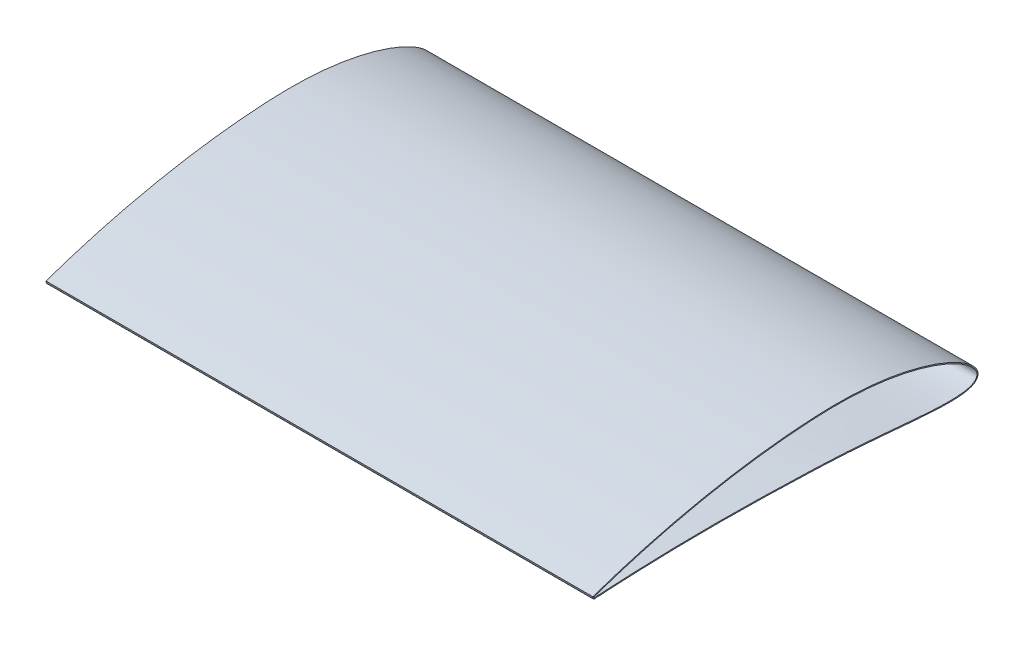
ISO-10303-21;
HEADER;
FILE_DESCRIPTION(('STEP AP214'),'2;1');
FILE_NAME('part.step','',(''),(''),'','','');
FILE_SCHEMA(('AUTOMOTIVE_DESIGN { 1 0 10303 214 1 1 1 1 }'));
ENDSEC;
DATA;
#1=APPLICATION_CONTEXT('core data for automotive mechanical design processes');
#2=APPLICATION_PROTOCOL_DEFINITION('international standard','automotive_design',2000,#1);
#3=PRODUCT_CONTEXT('',#1,'mechanical');
#4=PRODUCT('Part','Part','',(#3));
#5=PRODUCT_RELATED_PRODUCT_CATEGORY('part','',(#4));
#6=PRODUCT_DEFINITION_FORMATION('','',#4);
#7=PRODUCT_DEFINITION_CONTEXT('part definition',#1,'design');
#8=PRODUCT_DEFINITION('design','',#6,#7);
#9=PRODUCT_DEFINITION_SHAPE('','',#8);
#10=(LENGTH_UNIT() NAMED_UNIT(*) SI_UNIT(.MILLI.,.METRE.));
#11=(NAMED_UNIT(*) PLANE_ANGLE_UNIT() SI_UNIT($,.RADIAN.));
#12=(NAMED_UNIT(*) SI_UNIT($,.STERADIAN.) SOLID_ANGLE_UNIT());
#13=UNCERTAINTY_MEASURE_WITH_UNIT(LENGTH_MEASURE(1.E-05),#10,'distance_accuracy_value','');
#14=(GEOMETRIC_REPRESENTATION_CONTEXT(3) GLOBAL_UNCERTAINTY_ASSIGNED_CONTEXT((#13)) GLOBAL_UNIT_ASSIGNED_CONTEXT((#10,
#11,#12)) REPRESENTATION_CONTEXT('',''));
#15=CARTESIAN_POINT('',(0.,0.,0.));
#16=DIRECTION('',(0.,0.,1.));
#17=DIRECTION('',(1.,0.,0.));
#18=AXIS2_PLACEMENT_3D('',#15,#16,#17);
#19=CARTESIAN_POINT('',(-254.,-0.160012785393524,355.781288272021));
#20=CARTESIAN_POINT('',(-254.,-0.260724663014082,355.774783772929));
#21=CARTESIAN_POINT('',(-254.,-0.422606954620762,355.758637621734));
#22=CARTESIAN_POINT('',(-254.,-0.816807397927715,355.686815981531));
#23=CARTESIAN_POINT('',(-254.,-1.24668309021615,355.373142592051));
#24=CARTESIAN_POINT('',(-254.,-1.5235266277005,354.952837035878));
#25=CARTESIAN_POINT('',(-254.,-1.59412717480584,354.489636694886));
#26=CARTESIAN_POINT('',(-254.,-1.55511831483012,354.125296694906));
#27=CARTESIAN_POINT('',(-254.,-1.48926631006654,353.833974728871));
#28=CARTESIAN_POINT('',(-254.,-1.41795546513307,353.586061484338));
#29=CARTESIAN_POINT('',(-254.,-1.34320584663628,353.327273482467));
#30=CARTESIAN_POINT('',(-254.,-1.27751143428968,353.041582437258));
#31=CARTESIAN_POINT('',(-254.,-1.20688478411556,352.608380679005));
#32=CARTESIAN_POINT('',(-254.,-1.17596662973425,352.110927161072));
#33=CARTESIAN_POINT('',(-254.,-1.19263606913297,351.512724547263));
#34=CARTESIAN_POINT('',(-254.,-1.24772810685362,350.625622719737));
#35=CARTESIAN_POINT('',(-254.,-1.24043366886849,349.393297778936));
#36=CARTESIAN_POINT('',(-254.,-1.14106956808064,347.924581996849));
#37=CARTESIAN_POINT('',(-254.,-1.00501012741958,346.442969675704));
#38=CARTESIAN_POINT('',(-254.,-0.882175474662884,345.003214170463));
#39=CARTESIAN_POINT('',(-254.,-0.758153302013649,343.103292828497));
#40=CARTESIAN_POINT('',(-254.,-0.648856976782544,340.751794954618));
#41=CARTESIAN_POINT('',(-254.,-0.528754705676155,337.91042592086));
#42=CARTESIAN_POINT('',(-254.,-0.383405167440616,335.04987757254));
#43=CARTESIAN_POINT('',(-254.,-0.180109911055271,331.229276996453));
#44=CARTESIAN_POINT('',(-254.,0.0595542102886685,326.465376681876));
#45=CARTESIAN_POINT('',(-254.,0.311301964190964,320.757606453955));
#46=CARTESIAN_POINT('',(-254.,0.551818103414884,315.042784683889));
#47=CARTESIAN_POINT('',(-254.,0.776871866603853,309.325901329555));
#48=CARTESIAN_POINT('',(-254.,0.981309316548218,303.60966606416));
#49=CARTESIAN_POINT('',(-254.,1.22741464350278,295.987597162456));
#50=CARTESIAN_POINT('',(-254.,1.49505854858948,286.457612494315));
#51=CARTESIAN_POINT('',(-254.,1.74043742031699,275.021421222394));
#52=CARTESIAN_POINT('',(-254.,1.90420797940893,263.582914744213));
#53=CARTESIAN_POINT('',(-254.,1.99766923442384,252.143380177539));
#54=CARTESIAN_POINT('',(-254.,2.025028249374,236.89037417125));
#55=CARTESIAN_POINT('',(-254.,1.87690455809523,217.824281848333));
#56=CARTESIAN_POINT('',(-254.,1.44069626913339,194.945600608681));
#57=CARTESIAN_POINT('',(-254.,0.894354977689763,175.885320809337));
#58=CARTESIAN_POINT('',(-254.,0.366671857184103,160.635246225858));
#59=CARTESIAN_POINT('',(-254.,-0.151084525680473,145.383072414511));
#60=CARTESIAN_POINT('',(-254.,-0.963185187607268,126.343691669332));
#61=CARTESIAN_POINT('',(-254.,-2.29570442966772,107.332608050142));
#62=CARTESIAN_POINT('',(-254.,-3.55147070290262,92.131319946367));
#63=CARTESIAN_POINT('',(-254.,-4.55567876497996,80.7331703173261));
#64=CARTESIAN_POINT('',(-254.,-5.58263605824077,69.3332838340375));
#65=CARTESIAN_POINT('',(-254.,-6.58436139248711,57.9263635978013));
#66=CARTESIAN_POINT('',(-254.,-7.33868734097606,48.4067013657674));
#67=CARTESIAN_POINT('',(-254.,-7.83236475895651,40.7762422905909));
#68=CARTESIAN_POINT('',(-254.,-8.1273448501417,35.0454622837662));
#69=CARTESIAN_POINT('',(-254.,-8.31775249266283,29.3027203134908));
#70=CARTESIAN_POINT('',(-254.,-8.36146508783106,23.5483061910895));
#71=CARTESIAN_POINT('',(-254.,-8.18752966483548,17.7821248111899));
#72=CARTESIAN_POINT('',(-254.,-7.7690139933705,12.9595856167686));
#73=CARTESIAN_POINT('',(-254.,-7.14072544798187,9.11634215741616));
#74=CARTESIAN_POINT('',(-254.,-6.44631169359271,6.24127532632541));
#75=CARTESIAN_POINT('',(-254.,-5.45435028454066,3.40921725590063));
#76=CARTESIAN_POINT('',(-254.,-4.13367895958201,1.11523400102716));
#77=CARTESIAN_POINT('',(-254.,-2.54458809044118,-0.433867293340652));
#78=CARTESIAN_POINT('',(-254.,-1.10871967999657,-1.34390445793132));
#79=CARTESIAN_POINT('',(-254.,0.580355827871294,-1.82867386978638));
#80=CARTESIAN_POINT('',(-254.,2.85052153367501,-1.82668349147424));
#81=CARTESIAN_POINT('',(-254.,5.47061883086868,-0.953615267918231));
#82=CARTESIAN_POINT('',(-254.,7.99927871719681,0.809730437342807));
#83=CARTESIAN_POINT('',(-254.,10.2108294108204,2.80412445437323));
#84=CARTESIAN_POINT('',(-254.,12.8485000864783,5.72010294360929));
#85=CARTESIAN_POINT('',(-254.,15.7331042080959,9.63650689316799));
#86=CARTESIAN_POINT('',(-254.,18.7673719769425,14.5783925119411));
#87=CARTESIAN_POINT('',(-254.,21.4885809947311,19.6779964584068));
#88=CARTESIAN_POINT('',(-254.,23.9576606831746,24.8923985102312));
#89=CARTESIAN_POINT('',(-254.,26.9597143691512,31.9663037533705));
#90=CARTESIAN_POINT('',(-254.,30.2423904570102,40.9837374655094));
#91=CARTESIAN_POINT('',(-254.,33.5569382347417,52.0006694104999));
#92=CARTESIAN_POINT('',(-254.,36.3175708694355,63.1626167527749));
#93=CARTESIAN_POINT('',(-254.,38.5688563856449,74.4340414939907));
#94=CARTESIAN_POINT('',(-254.,40.936854636466,89.5703758686101));
#95=CARTESIAN_POINT('',(-254.,42.7966392687554,108.633179861665));
#96=CARTESIAN_POINT('',(-254.,43.3755286897958,131.607338659795));
#97=CARTESIAN_POINT('',(-254.,42.4483987385977,154.543117894496));
#98=CARTESIAN_POINT('',(-254.,40.6676492849251,177.399289958146));
#99=CARTESIAN_POINT('',(-254.,38.1139239789693,200.187559856485));
#100=CARTESIAN_POINT('',(-254.,33.7216535797013,230.439677725932));
#101=CARTESIAN_POINT('',(-254.,26.5041921859137,267.97219865512));
#102=CARTESIAN_POINT('',(-254.,17.1397742671702,305.022743766761));
#103=CARTESIAN_POINT('',(-254.,8.39870049896719,334.313734934284));
#104=CARTESIAN_POINT('',(-254.,3.55911324246915,348.806819492272));
#105=CARTESIAN_POINT('',(-254.,1.07078060987209,356.02943210171));
#106=B_SPLINE_CURVE_WITH_KNOTS('',3,(#19,#20,#21,#22,#23,#24,#25,#26,#27,#28,#29,#30,#31,#32,
#33,#34,#35,#36,#37,#38,#39,#40,#41,#42,#43,#44,#45,#46,#47,#48,#49,#50,#51,#52,#53,#54,#55,#56,
#57,#58,#59,#60,#61,#62,#63,#64,#65,#66,#67,#68,#69,#70,#71,#72,#73,#74,#75,#76,#77,#78,#79,#80,
#81,#82,#83,#84,#85,#86,#87,#88,#89,#90,#91,#92,#93,#94,#95,#96,#97,#98,#99,#100,#101,#102,#103,
#104,#105),.UNSPECIFIED.,.F.,.F.,(4,1,1,1,1,1,1,1,1,1,1,1,1,1,1,1,1,1,1,1,1,1,1,1,1,1,1,1,1,1,1,
1,1,1,1,1,1,1,1,1,1,1,1,1,1,1,1,1,1,1,1,1,1,1,1,1,1,1,1,1,1,1,1,1,1,1,1,1,1,1,1,1,1,1,1,1,1,1,1,
1,1,1,1,1,4),(-0.00119615790120819,-0.000951744244878199,-0.000707330588548209,
-0.000585123760383215,-0.00046291693221822,-0.000218503275888342,2.59103804415362E-05,
0.000270324036771525,0.000514737693101515,0.000759151349431504,0.00124797866209148,
0.00173680597475135,0.0027144606000712,0.00369211522539104,0.00466976985071089,
0.00662507910135047,0.00858038835199005,0.0105356976026297,0.0124910068532694,
0.0144463161039091,0.0183569346051885,0.0222675531064679,0.0261781716077473,0.0300887901090265,
0.0379100271115852,0.045731264114144,0.0535525011167026,0.0613737381192613,0.0691949751218199,
0.0770162121243786,0.092658686129496,0.108301160134613,0.123943634139731,0.139586108144848,
0.155228582149965,0.1865135301602,0.217798478170435,0.24908342618067,0.264725900185787,
0.280368374190904,0.311653322201139,0.342938270211374,0.358580744216491,0.374223218221608,
0.389865692226726,0.405508166231843,0.421150640236961,0.428971877239519,0.436793114242078,
0.444614351244637,0.452435588247195,0.460256825249754,0.468078062252313,0.471988680753592,
0.475899299254871,0.479809917756151,0.48372053625743,0.48567584550807,0.487631154758709,
0.489586464009349,0.491541773259989,0.495452391761268,0.499363010262547,0.503273628763827,
0.507184247265106,0.515005484267665,0.522826721270223,0.530647958272782,0.538469195275341,
0.546290432277899,0.561932906283017,0.577575380288134,0.593217854293251,0.608860328298369,
0.624502802303486,0.655787750313721,0.687072698323956,0.71835764633419,0.749642594344425,
0.78092754235466,0.812212490364895,0.874782386385364,0.937352282405833,0.968637230416068,
0.999922178426303),.UNSPECIFIED.);
#107=DIRECTION('',(1.,0.,0.));
#108=VECTOR('',#107,1.);
#109=SURFACE_OF_LINEAR_EXTRUSION('',#106,#108);
#110=DIRECTION('',(1.,0.,0.));
#111=VECTOR('',#110,1.);
#112=CARTESIAN_POINT('',(-254.,1.07078060987209,356.02943210171));
#113=LINE('',#112,#111);
#114=CARTESIAN_POINT('',(-254.,1.07078060987209,356.02943210171));
#115=VERTEX_POINT('',#114);
#116=CARTESIAN_POINT('',(254.,1.07078060987209,356.02943210171));
#117=VERTEX_POINT('',#116);
#118=EDGE_CURVE('E45',#115,#117,#113,.T.);
#119=ORIENTED_EDGE('',*,*,#118,.T.);
#120=CARTESIAN_POINT('',(254.,-0.160012785393524,355.781288272021));
#121=CARTESIAN_POINT('',(254.,-0.260724663014082,355.774783772929));
#122=CARTESIAN_POINT('',(254.,-0.422606954620762,355.758637621734));
#123=CARTESIAN_POINT('',(254.,-0.816807397927715,355.686815981531));
#124=CARTESIAN_POINT('',(254.,-1.24668309021615,355.373142592051));
#125=CARTESIAN_POINT('',(254.,-1.5235266277005,354.952837035878));
#126=CARTESIAN_POINT('',(254.,-1.59412717480584,354.489636694886));
#127=CARTESIAN_POINT('',(254.,-1.55511831483012,354.125296694906));
#128=CARTESIAN_POINT('',(254.,-1.48926631006654,353.833974728871));
#129=CARTESIAN_POINT('',(254.,-1.41795546513307,353.586061484338));
#130=CARTESIAN_POINT('',(254.,-1.34320584663628,353.327273482467));
#131=CARTESIAN_POINT('',(254.,-1.27751143428968,353.041582437258));
#132=CARTESIAN_POINT('',(254.,-1.20688478411556,352.608380679005));
#133=CARTESIAN_POINT('',(254.,-1.17596662973425,352.110927161072));
#134=CARTESIAN_POINT('',(254.,-1.19263606913297,351.512724547263));
#135=CARTESIAN_POINT('',(254.,-1.24772810685362,350.625622719737));
#136=CARTESIAN_POINT('',(254.,-1.24043366886849,349.393297778936));
#137=CARTESIAN_POINT('',(254.,-1.14106956808064,347.924581996849));
#138=CARTESIAN_POINT('',(254.,-1.00501012741958,346.442969675704));
#139=CARTESIAN_POINT('',(254.,-0.882175474662884,345.003214170463));
#140=CARTESIAN_POINT('',(254.,-0.758153302013649,343.103292828497));
#141=CARTESIAN_POINT('',(254.,-0.648856976782544,340.751794954618));
#142=CARTESIAN_POINT('',(254.,-0.528754705676155,337.91042592086));
#143=CARTESIAN_POINT('',(254.,-0.383405167440616,335.04987757254));
#144=CARTESIAN_POINT('',(254.,-0.180109911055271,331.229276996453));
#145=CARTESIAN_POINT('',(254.,0.0595542102886685,326.465376681876));
#146=CARTESIAN_POINT('',(254.,0.311301964190964,320.757606453955));
#147=CARTESIAN_POINT('',(254.,0.551818103414884,315.042784683889));
#148=CARTESIAN_POINT('',(254.,0.776871866603853,309.325901329555));
#149=CARTESIAN_POINT('',(254.,0.981309316548218,303.60966606416));
#150=CARTESIAN_POINT('',(254.,1.22741464350278,295.987597162456));
#151=CARTESIAN_POINT('',(254.,1.49505854858948,286.457612494315));
#152=CARTESIAN_POINT('',(254.,1.74043742031699,275.021421222394));
#153=CARTESIAN_POINT('',(254.,1.90420797940893,263.582914744213));
#154=CARTESIAN_POINT('',(254.,1.99766923442384,252.143380177539));
#155=CARTESIAN_POINT('',(254.,2.025028249374,236.89037417125));
#156=CARTESIAN_POINT('',(254.,1.87690455809523,217.824281848333));
#157=CARTESIAN_POINT('',(254.,1.44069626913339,194.945600608681));
#158=CARTESIAN_POINT('',(254.,0.894354977689763,175.885320809337));
#159=CARTESIAN_POINT('',(254.,0.366671857184103,160.635246225858));
#160=CARTESIAN_POINT('',(254.,-0.151084525680473,145.383072414511));
#161=CARTESIAN_POINT('',(254.,-0.963185187607268,126.343691669332));
#162=CARTESIAN_POINT('',(254.,-2.29570442966772,107.332608050142));
#163=CARTESIAN_POINT('',(254.,-3.55147070290262,92.131319946367));
#164=CARTESIAN_POINT('',(254.,-4.55567876497996,80.7331703173261));
#165=CARTESIAN_POINT('',(254.,-5.58263605824077,69.3332838340375));
#166=CARTESIAN_POINT('',(254.,-6.58436139248711,57.9263635978013));
#167=CARTESIAN_POINT('',(254.,-7.33868734097606,48.4067013657674));
#168=CARTESIAN_POINT('',(254.,-7.83236475895651,40.7762422905909));
#169=CARTESIAN_POINT('',(254.,-8.1273448501417,35.0454622837662));
#170=CARTESIAN_POINT('',(254.,-8.31775249266283,29.3027203134908));
#171=CARTESIAN_POINT('',(254.,-8.36146508783106,23.5483061910895));
#172=CARTESIAN_POINT('',(254.,-8.18752966483548,17.7821248111899));
#173=CARTESIAN_POINT('',(254.,-7.7690139933705,12.9595856167686));
#174=CARTESIAN_POINT('',(254.,-7.14072544798187,9.11634215741616));
#175=CARTESIAN_POINT('',(254.,-6.44631169359271,6.24127532632541));
#176=CARTESIAN_POINT('',(254.,-5.45435028454066,3.40921725590063));
#177=CARTESIAN_POINT('',(254.,-4.13367895958201,1.11523400102716));
#178=CARTESIAN_POINT('',(254.,-2.54458809044118,-0.433867293340652));
#179=CARTESIAN_POINT('',(254.,-1.10871967999657,-1.34390445793132));
#180=CARTESIAN_POINT('',(254.,0.580355827871294,-1.82867386978638));
#181=CARTESIAN_POINT('',(254.,2.85052153367501,-1.82668349147424));
#182=CARTESIAN_POINT('',(254.,5.47061883086868,-0.953615267918231));
#183=CARTESIAN_POINT('',(254.,7.99927871719681,0.809730437342807));
#184=CARTESIAN_POINT('',(254.,10.2108294108204,2.80412445437323));
#185=CARTESIAN_POINT('',(254.,12.8485000864783,5.72010294360929));
#186=CARTESIAN_POINT('',(254.,15.7331042080959,9.63650689316799));
#187=CARTESIAN_POINT('',(254.,18.7673719769425,14.5783925119411));
#188=CARTESIAN_POINT('',(254.,21.4885809947311,19.6779964584068));
#189=CARTESIAN_POINT('',(254.,23.9576606831746,24.8923985102312));
#190=CARTESIAN_POINT('',(254.,26.9597143691512,31.9663037533705));
#191=CARTESIAN_POINT('',(254.,30.2423904570102,40.9837374655094));
#192=CARTESIAN_POINT('',(254.,33.5569382347417,52.0006694104999));
#193=CARTESIAN_POINT('',(254.,36.3175708694355,63.1626167527749));
#194=CARTESIAN_POINT('',(254.,38.5688563856449,74.4340414939907));
#195=CARTESIAN_POINT('',(254.,40.936854636466,89.5703758686101));
#196=CARTESIAN_POINT('',(254.,42.7966392687554,108.633179861665));
#197=CARTESIAN_POINT('',(254.,43.3755286897958,131.607338659795));
#198=CARTESIAN_POINT('',(254.,42.4483987385977,154.543117894496));
#199=CARTESIAN_POINT('',(254.,40.6676492849251,177.399289958146));
#200=CARTESIAN_POINT('',(254.,38.1139239789693,200.187559856485));
#201=CARTESIAN_POINT('',(254.,33.7216535797013,230.439677725932));
#202=CARTESIAN_POINT('',(254.,26.5041921859137,267.97219865512));
#203=CARTESIAN_POINT('',(254.,17.1397742671702,305.022743766761));
#204=CARTESIAN_POINT('',(254.,8.39870049896719,334.313734934284));
#205=CARTESIAN_POINT('',(254.,3.55911324246915,348.806819492272));
#206=CARTESIAN_POINT('',(254.,1.07078060987209,356.02943210171));
#207=B_SPLINE_CURVE_WITH_KNOTS('',3,(#120,#121,#122,#123,#124,#125,#126,#127,#128,#129,#130,
#131,#132,#133,#134,#135,#136,#137,#138,#139,#140,#141,#142,#143,#144,#145,#146,#147,#148,#149,
#150,#151,#152,#153,#154,#155,#156,#157,#158,#159,#160,#161,#162,#163,#164,#165,#166,#167,#168,
#169,#170,#171,#172,#173,#174,#175,#176,#177,#178,#179,#180,#181,#182,#183,#184,#185,#186,#187,
#188,#189,#190,#191,#192,#193,#194,#195,#196,#197,#198,#199,#200,#201,#202,#203,#204,#205,#206),
.UNSPECIFIED.,.F.,.F.,(4,1,1,1,1,1,1,1,1,1,1,1,1,1,1,1,1,1,1,1,1,1,1,1,1,1,1,1,1,1,1,1,1,1,1,1,
1,1,1,1,1,1,1,1,1,1,1,1,1,1,1,1,1,1,1,1,1,1,1,1,1,1,1,1,1,1,1,1,1,1,1,1,1,1,1,1,1,1,1,1,1,1,1,1,
4),(-0.00119615790120819,-0.000951744244878199,-0.000707330588548209,-0.000585123760383215,
-0.00046291693221822,-0.000218503275888342,2.59103804415362E-05,0.000270324036771525,
0.000514737693101515,0.000759151349431504,0.00124797866209148,0.00173680597475135,
0.0027144606000712,0.00369211522539104,0.00466976985071089,0.00662507910135047,
0.00858038835199005,0.0105356976026297,0.0124910068532694,0.0144463161039091,0.0183569346051885,
0.0222675531064679,0.0261781716077473,0.0300887901090265,0.0379100271115852,0.045731264114144,
0.0535525011167026,0.0613737381192613,0.0691949751218199,0.0770162121243786,0.092658686129496,
0.108301160134613,0.123943634139731,0.139586108144848,0.155228582149965,0.1865135301602,
0.217798478170435,0.24908342618067,0.264725900185787,0.280368374190904,0.311653322201139,
0.342938270211374,0.358580744216491,0.374223218221608,0.389865692226726,0.405508166231843,
0.421150640236961,0.428971877239519,0.436793114242078,0.444614351244637,0.452435588247195,
0.460256825249754,0.468078062252313,0.471988680753592,0.475899299254871,0.479809917756151,
0.48372053625743,0.48567584550807,0.487631154758709,0.489586464009349,0.491541773259989,
0.495452391761268,0.499363010262547,0.503273628763827,0.507184247265106,0.515005484267665,
0.522826721270223,0.530647958272782,0.538469195275341,0.546290432277899,0.561932906283017,
0.577575380288134,0.593217854293251,0.608860328298369,0.624502802303486,0.655787750313721,
0.687072698323956,0.71835764633419,0.749642594344425,0.78092754235466,0.812212490364895,
0.874782386385364,0.937352282405833,0.968637230416068,0.999922178426303),.UNSPECIFIED.);
#208=CARTESIAN_POINT('',(254.,-0.160012785393524,355.781288272021));
#209=VERTEX_POINT('',#208);
#210=EDGE_CURVE('E97',#209,#117,#207,.T.);
#211=ORIENTED_EDGE('',*,*,#210,.F.);
#212=DIRECTION('',(1.,0.,0.));
#213=VECTOR('',#212,1.);
#214=CARTESIAN_POINT('',(-254.,-0.160012785393524,355.781288272021));
#215=LINE('',#214,#213);
#216=CARTESIAN_POINT('',(-254.,-0.160012785393524,355.781288272021));
#217=VERTEX_POINT('',#216);
#218=EDGE_CURVE('E11',#217,#209,#215,.T.);
#219=ORIENTED_EDGE('',*,*,#218,.F.);
#220=EDGE_CURVE('E90',#217,#115,#106,.T.);
#221=ORIENTED_EDGE('',*,*,#220,.T.);
#222=EDGE_LOOP('',(#119,#211,#219,#221));
#223=FACE_BOUND('',#222,.T.);
#224=ADVANCED_FACE('F41',(#223),#109,.T.);
#225=CARTESIAN_POINT('',(-254.,-0.160012785393524,355.781288272021));
#226=DIRECTION('',(0.,-0.197636177725009,0.98027544152358));
#227=DIRECTION('',(0.,-0.98027544152358,-0.197636177725009));
#228=AXIS2_PLACEMENT_3D('',#225,#226,#227);
#229=PLANE('',#228);
#230=ORIENTED_EDGE('',*,*,#218,.T.);
#231=DIRECTION('',(0.,-0.980275441523579,-0.197636177725009));
#232=VECTOR('',#231,1.);
#233=CARTESIAN_POINT('',(254.,-0.160012785393524,355.781288272021));
#234=LINE('',#233,#232);
#235=EDGE_CURVE('E113',#117,#209,#234,.T.);
#236=ORIENTED_EDGE('',*,*,#235,.F.);
#237=ORIENTED_EDGE('',*,*,#118,.F.);
#238=DIRECTION('',(0.,-0.980275441523579,-0.197636177725009));
#239=VECTOR('',#238,1.);
#240=CARTESIAN_POINT('',(-254.,-0.160012785393524,355.781288272021));
#241=LINE('',#240,#239);
#242=EDGE_CURVE('E146',#115,#217,#241,.T.);
#243=ORIENTED_EDGE('',*,*,#242,.T.);
#244=EDGE_LOOP('',(#230,#236,#237,#243));
#245=FACE_BOUND('',#244,.T.);
#246=ADVANCED_FACE('F136',(#245),#229,.T.);
#247=CARTESIAN_POINT('',(-254.,7.94642718507942,0.848238489304398));
#248=DIRECTION('',(1.,0.,0.));
#249=DIRECTION('',(0.,0.,-1.));
#250=AXIS2_PLACEMENT_3D('',#247,#248,#249);
#251=PLANE('',#250);
#252=DIRECTION('',(0.,-0.980275441523261,-0.197636177726589));
#253=VECTOR('',#252,1.);
#254=CARTESIAN_POINT('',(-254.,-0.030257196476355,354.787327227915));
#255=LINE('',#254,#253);
#256=CARTESIAN_POINT('',(-254.,0.410417886541196,354.876173010782));
#257=VERTEX_POINT('',#256);
#258=CARTESIAN_POINT('',(-254.,-0.0302571964763548,354.787327227915));
#259=VERTEX_POINT('',#258);
#260=EDGE_CURVE('E125',#257,#259,#255,.T.);
#261=ORIENTED_EDGE('',*,*,#260,.T.);
#262=CARTESIAN_POINT('',(-254.,-0.0302571964763549,354.787327227915));
#263=CARTESIAN_POINT('',(-254.,-0.202511549774369,354.777220058735));
#264=CARTESIAN_POINT('',(-254.,-0.758116619532224,354.744619463571));
#265=CARTESIAN_POINT('',(-254.,-0.0353878265544988,352.780150329408));
#266=CARTESIAN_POINT('',(-254.,-0.406394891328532,350.227621537646));
#267=CARTESIAN_POINT('',(-254.,0.191518705423128,345.076973542852));
#268=CARTESIAN_POINT('',(-254.,0.426846954997304,338.388880463138));
#269=CARTESIAN_POINT('',(-254.,0.912902226587254,329.767358245601));
#270=CARTESIAN_POINT('',(-254.,1.37107480853054,319.513378005819));
#271=CARTESIAN_POINT('',(-254.,1.85212662662604,307.681856469284));
#272=CARTESIAN_POINT('',(-254.,2.2828903737653,294.437996631764));
#273=CARTESIAN_POINT('',(-254.,2.65636592644588,279.933149694368));
#274=CARTESIAN_POINT('',(-254.,2.90744759821903,264.337268620967));
#275=CARTESIAN_POINT('',(-254.,3.02848065946825,247.830237404837));
#276=CARTESIAN_POINT('',(-254.,2.97910623211237,224.541124113717));
#277=CARTESIAN_POINT('',(-254.,2.58624656268472,200.671973719441));
#278=CARTESIAN_POINT('',(-254.,1.91789319340299,176.483884619505));
#279=CARTESIAN_POINT('',(-254.,1.28674404323604,158.296467958687));
#280=CARTESIAN_POINT('',(-254.,0.674535202653767,140.48477689744));
#281=CARTESIAN_POINT('',(-254.,-0.458414507964394,117.937239158073));
#282=CARTESIAN_POINT('',(-254.,-2.15355585803942,96.4067365521407));
#283=CARTESIAN_POINT('',(-254.,-3.98391169785236,75.9298626432168));
#284=CARTESIAN_POINT('',(-254.,-5.23803481691952,61.9523939500743));
#285=CARTESIAN_POINT('',(-254.,-6.3018667845873,49.0830780174977));
#286=CARTESIAN_POINT('',(-254.,-7.05379709208437,37.4470572233417));
#287=CARTESIAN_POINT('',(-254.,-7.40487495085787,27.1638266260831));
#288=CARTESIAN_POINT('',(-254.,-7.26852765592077,18.3491197902741));
#289=CARTESIAN_POINT('',(-254.,-6.58746462442697,11.0873159681167));
#290=CARTESIAN_POINT('',(-254.,-5.28808573883758,5.4507808849597));
#291=CARTESIAN_POINT('',(-254.,-3.30894318563573,1.35108725963543));
#292=CARTESIAN_POINT('',(-254.,-0.148325215865237,-0.987487677240321));
#293=CARTESIAN_POINT('',(-254.,3.7967578133831,-0.765838064798878));
#294=CARTESIAN_POINT('',(-254.,7.71649979382027,1.67922407257184));
#295=CARTESIAN_POINT('',(-254.,11.8553419578337,5.92689766090299));
#296=CARTESIAN_POINT('',(-254.,16.2262899348965,12.1072031542234));
#297=CARTESIAN_POINT('',(-254.,20.7343193498453,20.187014187513));
#298=CARTESIAN_POINT('',(-254.,25.2201252971746,30.130463623116));
#299=CARTESIAN_POINT('',(-254.,29.5108543834638,41.8433907768923));
#300=CARTESIAN_POINT('',(-254.,33.4329059974258,55.1997604360673));
#301=CARTESIAN_POINT('',(-254.,36.8104805743368,70.0434509571498));
#302=CARTESIAN_POINT('',(-254.,39.4786761807971,86.1884085277303));
#303=CARTESIAN_POINT('',(-254.,41.32105063238,103.42216726238));
#304=CARTESIAN_POINT('',(-254.,42.2288581946823,121.516747473044));
#305=CARTESIAN_POINT('',(-254.,42.1113766684293,140.09669102153));
#306=CARTESIAN_POINT('',(-254.,41.1132128906756,158.902335219002));
#307=CARTESIAN_POINT('',(-254.,39.0904540579609,183.961657870227));
#308=CARTESIAN_POINT('',(-254.,36.0047557168601,208.774809212926));
#309=CARTESIAN_POINT('',(-254.,31.1455287976255,238.622276389231));
#310=CARTESIAN_POINT('',(-254.,26.6515697314507,261.175777938493));
#311=CARTESIAN_POINT('',(-254.,21.7242725259394,282.422876263721));
#312=CARTESIAN_POINT('',(-254.,17.1306006385399,300.598349456261));
#313=CARTESIAN_POINT('',(-254.,11.7988919274353,319.654473711953));
#314=CARTESIAN_POINT('',(-254.,6.72155114802005,336.024074691811));
#315=CARTESIAN_POINT('',(-254.,3.49779827393597,345.800950265157));
#316=CARTESIAN_POINT('',(-254.,1.92709586834348,350.478726649503));
#317=CARTESIAN_POINT('',(-254.,0.953557869568799,353.29965963041));
#318=CARTESIAN_POINT('',(-254.,0.519388000117919,354.559877308969));
#319=CARTESIAN_POINT('',(-254.,0.410417886541196,354.876173010782));
#320=B_SPLINE_CURVE_WITH_KNOTS('',3,(#262,#263,#264,#265,#266,#267,#268,#269,#270,#271,#272,
#273,#274,#275,#276,#277,#278,#279,#280,#281,#282,#283,#284,#285,#286,#287,#288,#289,#290,#291,
#292,#293,#294,#295,#296,#297,#298,#299,#300,#301,#302,#303,#304,#305,#306,#307,#308,#309,#310,
#311,#312,#313,#314,#315,#316,#317,#318,#319),.UNSPECIFIED.,.F.,.F.,(4,1,1,1,1,1,1,1,1,1,1,1,1,
1,1,1,1,1,1,1,1,1,1,1,1,1,1,1,1,1,1,1,1,1,1,1,1,1,1,1,1,1,1,1,1,1,1,1,1,1,1,1,1,1,1,4),(0.,
0.00061435602735338,0.00198160056276364,0.00606849911990259,0.0128259983002053,
0.0221600600259541,0.0339528411484215,0.0480573219049674,0.0643016527838605,0.0824806064748046,
0.102390013464696,0.123786894847983,0.146429707819126,0.170067604158041,0.219268231220122,
0.244299756437978,0.269272617042279,0.293879334559277,0.317367886846568,0.361825599196296,
0.382415541627446,0.401655123624231,0.419361860817184,0.435356743556399,0.44945739068769,
0.461534248286615,0.471483960270294,0.479298491667603,0.485175806315722,0.489815015537041,
0.49445371882196,0.500384211459872,0.508369297965653,0.518670584727767,0.531320006060474,
0.54625561026072,0.563345994084458,0.58242326585592,0.60328874622392,0.625720296766354,
0.649474912467889,0.674310012117921,0.699958821683972,0.725614899189679,0.751503233324799,
0.803021620411888,0.828087427427487,0.875472920842336,0.897280851310736,0.917503738861992,
0.952328750245583,0.978398030734231,0.987765198149775,0.994535224157492,0.998628423374974,1.),.UNSPECIFIED.);
#321=EDGE_CURVE('E57',#259,#257,#320,.T.);
#322=ORIENTED_EDGE('',*,*,#321,.T.);
#323=EDGE_LOOP('',(#261,#322));
#324=FACE_BOUND('',#323,.T.);
#325=ORIENTED_EDGE('',*,*,#220,.F.);
#326=ORIENTED_EDGE('',*,*,#242,.F.);
#327=EDGE_LOOP('',(#325,#326));
#328=FACE_BOUND('',#327,.T.);
#329=ADVANCED_FACE('F133',(#324,#328),#251,.F.);
#330=DIRECTION('',(1.,0.,0.));
#331=VECTOR('',#330,1.);
#332=SURFACE_OF_LINEAR_EXTRUSION('',#320,#331);
#333=DIRECTION('',(1.,0.,0.));
#334=VECTOR('',#333,1.);
#335=CARTESIAN_POINT('',(-254.,-0.030257196476355,354.787327227915));
#336=LINE('',#335,#334);
#337=CARTESIAN_POINT('',(254.,-0.030257196476355,354.787327227915));
#338=VERTEX_POINT('',#337);
#339=EDGE_CURVE('E80',#259,#338,#336,.T.);
#340=ORIENTED_EDGE('',*,*,#339,.T.);
#341=CARTESIAN_POINT('',(254.,-0.0302571964763549,354.787327227915));
#342=CARTESIAN_POINT('',(254.,-0.202511549774369,354.777220058735));
#343=CARTESIAN_POINT('',(254.,-0.758116619532224,354.744619463571));
#344=CARTESIAN_POINT('',(254.,-0.0353878265544988,352.780150329408));
#345=CARTESIAN_POINT('',(254.,-0.406394891328532,350.227621537646));
#346=CARTESIAN_POINT('',(254.,0.191518705423128,345.076973542852));
#347=CARTESIAN_POINT('',(254.,0.426846954997304,338.388880463138));
#348=CARTESIAN_POINT('',(254.,0.912902226587254,329.767358245601));
#349=CARTESIAN_POINT('',(254.,1.37107480853054,319.513378005819));
#350=CARTESIAN_POINT('',(254.,1.85212662662604,307.681856469284));
#351=CARTESIAN_POINT('',(254.,2.2828903737653,294.437996631764));
#352=CARTESIAN_POINT('',(254.,2.65636592644588,279.933149694368));
#353=CARTESIAN_POINT('',(254.,2.90744759821903,264.337268620967));
#354=CARTESIAN_POINT('',(254.,3.02848065946825,247.830237404837));
#355=CARTESIAN_POINT('',(254.,2.97910623211237,224.541124113717));
#356=CARTESIAN_POINT('',(254.,2.58624656268472,200.671973719441));
#357=CARTESIAN_POINT('',(254.,1.91789319340299,176.483884619505));
#358=CARTESIAN_POINT('',(254.,1.28674404323604,158.296467958687));
#359=CARTESIAN_POINT('',(254.,0.674535202653767,140.48477689744));
#360=CARTESIAN_POINT('',(254.,-0.458414507964394,117.937239158073));
#361=CARTESIAN_POINT('',(254.,-2.15355585803942,96.4067365521407));
#362=CARTESIAN_POINT('',(254.,-3.98391169785236,75.9298626432168));
#363=CARTESIAN_POINT('',(254.,-5.23803481691952,61.9523939500743));
#364=CARTESIAN_POINT('',(254.,-6.3018667845873,49.0830780174977));
#365=CARTESIAN_POINT('',(254.,-7.05379709208437,37.4470572233417));
#366=CARTESIAN_POINT('',(254.,-7.40487495085787,27.1638266260831));
#367=CARTESIAN_POINT('',(254.,-7.26852765592077,18.3491197902741));
#368=CARTESIAN_POINT('',(254.,-6.58746462442697,11.0873159681167));
#369=CARTESIAN_POINT('',(254.,-5.28808573883758,5.4507808849597));
#370=CARTESIAN_POINT('',(254.,-3.30894318563573,1.35108725963543));
#371=CARTESIAN_POINT('',(254.,-0.148325215865237,-0.987487677240321));
#372=CARTESIAN_POINT('',(254.,3.7967578133831,-0.765838064798878));
#373=CARTESIAN_POINT('',(254.,7.71649979382027,1.67922407257184));
#374=CARTESIAN_POINT('',(254.,11.8553419578337,5.92689766090299));
#375=CARTESIAN_POINT('',(254.,16.2262899348965,12.1072031542234));
#376=CARTESIAN_POINT('',(254.,20.7343193498453,20.187014187513));
#377=CARTESIAN_POINT('',(254.,25.2201252971746,30.130463623116));
#378=CARTESIAN_POINT('',(254.,29.5108543834638,41.8433907768923));
#379=CARTESIAN_POINT('',(254.,33.4329059974258,55.1997604360673));
#380=CARTESIAN_POINT('',(254.,36.8104805743368,70.0434509571498));
#381=CARTESIAN_POINT('',(254.,39.4786761807971,86.1884085277303));
#382=CARTESIAN_POINT('',(254.,41.32105063238,103.42216726238));
#383=CARTESIAN_POINT('',(254.,42.2288581946823,121.516747473044));
#384=CARTESIAN_POINT('',(254.,42.1113766684293,140.09669102153));
#385=CARTESIAN_POINT('',(254.,41.1132128906756,158.902335219002));
#386=CARTESIAN_POINT('',(254.,39.0904540579609,183.961657870227));
#387=CARTESIAN_POINT('',(254.,36.0047557168601,208.774809212926));
#388=CARTESIAN_POINT('',(254.,31.1455287976255,238.622276389231));
#389=CARTESIAN_POINT('',(254.,26.6515697314507,261.175777938493));
#390=CARTESIAN_POINT('',(254.,21.7242725259394,282.422876263721));
#391=CARTESIAN_POINT('',(254.,17.1306006385399,300.598349456261));
#392=CARTESIAN_POINT('',(254.,11.7988919274353,319.654473711953));
#393=CARTESIAN_POINT('',(254.,6.72155114802005,336.024074691811));
#394=CARTESIAN_POINT('',(254.,3.49779827393597,345.800950265157));
#395=CARTESIAN_POINT('',(254.,1.92709586834348,350.478726649503));
#396=CARTESIAN_POINT('',(254.,0.953557869568799,353.29965963041));
#397=CARTESIAN_POINT('',(254.,0.519388000117919,354.559877308969));
#398=CARTESIAN_POINT('',(254.,0.410417886541196,354.876173010782));
#399=B_SPLINE_CURVE_WITH_KNOTS('',3,(#341,#342,#343,#344,#345,#346,#347,#348,#349,#350,#351,
#352,#353,#354,#355,#356,#357,#358,#359,#360,#361,#362,#363,#364,#365,#366,#367,#368,#369,#370,
#371,#372,#373,#374,#375,#376,#377,#378,#379,#380,#381,#382,#383,#384,#385,#386,#387,#388,#389,
#390,#391,#392,#393,#394,#395,#396,#397,#398),.UNSPECIFIED.,.F.,.F.,(4,1,1,1,1,1,1,1,1,1,1,1,1,
1,1,1,1,1,1,1,1,1,1,1,1,1,1,1,1,1,1,1,1,1,1,1,1,1,1,1,1,1,1,1,1,1,1,1,1,1,1,1,1,1,1,4),(0.,
0.00061435602735338,0.00198160056276364,0.00606849911990259,0.0128259983002053,
0.0221600600259541,0.0339528411484215,0.0480573219049674,0.0643016527838605,0.0824806064748046,
0.102390013464696,0.123786894847983,0.146429707819126,0.170067604158041,0.219268231220122,
0.244299756437978,0.269272617042279,0.293879334559277,0.317367886846568,0.361825599196296,
0.382415541627446,0.401655123624231,0.419361860817184,0.435356743556399,0.44945739068769,
0.461534248286615,0.471483960270294,0.479298491667603,0.485175806315722,0.489815015537041,
0.49445371882196,0.500384211459872,0.508369297965653,0.518670584727767,0.531320006060474,
0.54625561026072,0.563345994084458,0.58242326585592,0.60328874622392,0.625720296766354,
0.649474912467889,0.674310012117921,0.699958821683972,0.725614899189679,0.751503233324799,
0.803021620411888,0.828087427427487,0.875472920842336,0.897280851310736,0.917503738861992,
0.952328750245583,0.978398030734231,0.987765198149775,0.994535224157492,0.998628423374974,1.),.UNSPECIFIED.);
#400=CARTESIAN_POINT('',(254.,0.410417886541205,354.876173010782));
#401=VERTEX_POINT('',#400);
#402=EDGE_CURVE('E84',#338,#401,#399,.T.);
#403=ORIENTED_EDGE('',*,*,#402,.T.);
#404=DIRECTION('',(1.,0.,0.));
#405=VECTOR('',#404,1.);
#406=CARTESIAN_POINT('',(-254.,0.410417886541196,354.876173010782));
#407=LINE('',#406,#405);
#408=EDGE_CURVE('E91',#257,#401,#407,.T.);
#409=ORIENTED_EDGE('',*,*,#408,.F.);
#410=ORIENTED_EDGE('',*,*,#321,.F.);
#411=EDGE_LOOP('',(#340,#403,#409,#410));
#412=FACE_BOUND('',#411,.T.);
#413=ADVANCED_FACE('F82',(#412),#332,.F.);
#414=CARTESIAN_POINT('',(-254.,-0.030257196476355,354.787327227915));
#415=DIRECTION('',(0.,-0.197636177726589,0.980275441523261));
#416=DIRECTION('',(0.,-0.980275441523261,-0.197636177726589));
#417=AXIS2_PLACEMENT_3D('',#414,#415,#416);
#418=PLANE('',#417);
#419=ORIENTED_EDGE('',*,*,#408,.T.);
#420=DIRECTION('',(0.,-0.980275441523261,-0.197636177726589));
#421=VECTOR('',#420,1.);
#422=CARTESIAN_POINT('',(254.,-0.030257196476355,354.787327227915));
#423=LINE('',#422,#421);
#424=EDGE_CURVE('E93',#401,#338,#423,.T.);
#425=ORIENTED_EDGE('',*,*,#424,.T.);
#426=ORIENTED_EDGE('',*,*,#339,.F.);
#427=ORIENTED_EDGE('',*,*,#260,.F.);
#428=EDGE_LOOP('',(#419,#425,#426,#427));
#429=FACE_BOUND('',#428,.T.);
#430=ADVANCED_FACE('F94',(#429),#418,.F.);
#431=CARTESIAN_POINT('',(254.,7.94642718507942,0.848238489304398));
#432=DIRECTION('',(1.,0.,0.));
#433=DIRECTION('',(0.,0.,-1.));
#434=AXIS2_PLACEMENT_3D('',#431,#432,#433);
#435=PLANE('',#434);
#436=ORIENTED_EDGE('',*,*,#210,.T.);
#437=ORIENTED_EDGE('',*,*,#235,.T.);
#438=EDGE_LOOP('',(#436,#437));
#439=FACE_BOUND('',#438,.T.);
#440=ORIENTED_EDGE('',*,*,#424,.F.);
#441=ORIENTED_EDGE('',*,*,#402,.F.);
#442=EDGE_LOOP('',(#440,#441));
#443=FACE_BOUND('',#442,.T.);
#444=ADVANCED_FACE('F99',(#439,#443),#435,.T.);
#445=CLOSED_SHELL('',(#224,#246,#329,#413,#430,#444));
#446=MANIFOLD_SOLID_BREP('B2',#445);
#447=ADVANCED_BREP_SHAPE_REPRESENTATION('',(#18,#446),#14);
#448=SHAPE_DEFINITION_REPRESENTATION(#9,#447);
ENDSEC;
END-ISO-10303-21;
